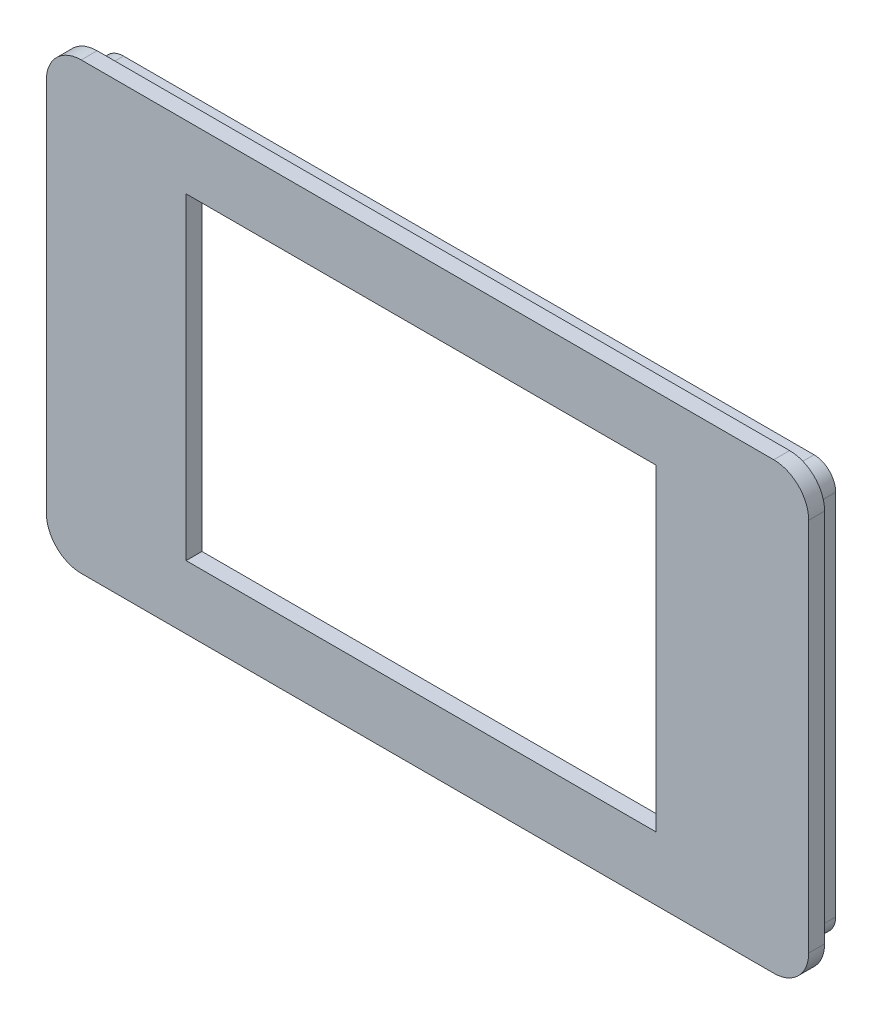
ISO-10303-21;
HEADER;
FILE_DESCRIPTION(('STEP AP214'),'2;1');
FILE_NAME('part.step','',(''),(''),'','','');
FILE_SCHEMA(('AUTOMOTIVE_DESIGN { 1 0 10303 214 1 1 1 1 }'));
ENDSEC;
DATA;
#1=APPLICATION_CONTEXT('core data for automotive mechanical design processes');
#2=APPLICATION_PROTOCOL_DEFINITION('international standard','automotive_design',2000,#1);
#3=PRODUCT_CONTEXT('',#1,'mechanical');
#4=PRODUCT('Part','Part','',(#3));
#5=PRODUCT_RELATED_PRODUCT_CATEGORY('part','',(#4));
#6=PRODUCT_DEFINITION_FORMATION('','',#4);
#7=PRODUCT_DEFINITION_CONTEXT('part definition',#1,'design');
#8=PRODUCT_DEFINITION('design','',#6,#7);
#9=PRODUCT_DEFINITION_SHAPE('','',#8);
#10=(LENGTH_UNIT() NAMED_UNIT(*) SI_UNIT(.MILLI.,.METRE.));
#11=(NAMED_UNIT(*) PLANE_ANGLE_UNIT() SI_UNIT($,.RADIAN.));
#12=(NAMED_UNIT(*) SI_UNIT($,.STERADIAN.) SOLID_ANGLE_UNIT());
#13=UNCERTAINTY_MEASURE_WITH_UNIT(LENGTH_MEASURE(1.E-05),#10,'distance_accuracy_value','');
#14=(GEOMETRIC_REPRESENTATION_CONTEXT(3) GLOBAL_UNCERTAINTY_ASSIGNED_CONTEXT((#13)) GLOBAL_UNIT_ASSIGNED_CONTEXT((#10,
#11,#12)) REPRESENTATION_CONTEXT('',''));
#15=CARTESIAN_POINT('',(0.,0.,0.));
#16=DIRECTION('',(0.,0.,1.));
#17=DIRECTION('',(1.,0.,0.));
#18=AXIS2_PLACEMENT_3D('',#15,#16,#17);
#19=CARTESIAN_POINT('',(0.,0.,0.));
#20=DIRECTION('',(0.,0.,1.));
#21=DIRECTION('',(1.,0.,0.));
#22=AXIS2_PLACEMENT_3D('',#19,#20,#21);
#23=PLANE('',#22);
#24=DIRECTION('',(0.,1.,0.));
#25=VECTOR('',#24,1.);
#26=CARTESIAN_POINT('',(44.6712724120404,25.0682598774568,0.));
#27=LINE('',#26,#25);
#28=CARTESIAN_POINT('',(44.6712724120404,-24.9317401225432,0.));
#29=VERTEX_POINT('',#28);
#30=CARTESIAN_POINT('',(44.6712724120404,25.0682598774568,0.));
#31=VERTEX_POINT('',#30);
#32=EDGE_CURVE('E401',#29,#31,#27,.T.);
#33=ORIENTED_EDGE('',*,*,#32,.T.);
#34=DIRECTION('',(-1.,0.,0.));
#35=VECTOR('',#34,1.);
#36=CARTESIAN_POINT('',(-29.3287275879596,25.0682598774568,0.));
#37=LINE('',#36,#35);
#38=CARTESIAN_POINT('',(-29.3287275879596,25.0682598774568,0.));
#39=VERTEX_POINT('',#38);
#40=EDGE_CURVE('E415',#31,#39,#37,.T.);
#41=ORIENTED_EDGE('',*,*,#40,.T.);
#42=DIRECTION('',(0.,-1.,0.));
#43=VECTOR('',#42,1.);
#44=CARTESIAN_POINT('',(-29.3287275879596,25.0682598774568,0.));
#45=LINE('',#44,#43);
#46=CARTESIAN_POINT('',(-29.3287275879596,-24.9317401225432,0.));
#47=VERTEX_POINT('',#46);
#48=EDGE_CURVE('E418',#39,#47,#45,.T.);
#49=ORIENTED_EDGE('',*,*,#48,.T.);
#50=DIRECTION('',(1.,0.,0.));
#51=VECTOR('',#50,1.);
#52=CARTESIAN_POINT('',(-29.3287275879596,-24.9317401225432,0.));
#53=LINE('',#52,#51);
#54=EDGE_CURVE('E405',#47,#29,#53,.T.);
#55=ORIENTED_EDGE('',*,*,#54,.T.);
#56=EDGE_LOOP('',(#33,#41,#49,#55));
#57=FACE_BOUND('',#56,.T.);
#58=CARTESIAN_POINT('',(63.0212724120405,29.0182598774568,0.));
#59=DIRECTION('',(0.,0.,-1.));
#60=DIRECTION('',(-1.,0.,0.));
#61=AXIS2_PLACEMENT_3D('',#58,#59,#60);
#62=CIRCLE('',#61,1.4);
#63=CARTESIAN_POINT('',(63.0212724120405,30.4182598774568,0.));
#64=VERTEX_POINT('',#63);
#65=CARTESIAN_POINT('',(64.4212724120405,29.0182598774568,0.));
#66=VERTEX_POINT('',#65);
#67=EDGE_CURVE('E280',#64,#66,#62,.T.);
#68=ORIENTED_EDGE('',*,*,#67,.T.);
#69=DIRECTION('',(0.,-1.,0.));
#70=VECTOR('',#69,1.);
#71=CARTESIAN_POINT('',(64.4212724120405,29.0182598774568,0.));
#72=LINE('',#71,#70);
#73=CARTESIAN_POINT('',(64.4212724120405,-28.8817401225433,0.));
#74=VERTEX_POINT('',#73);
#75=EDGE_CURVE('E310',#66,#74,#72,.T.);
#76=ORIENTED_EDGE('',*,*,#75,.T.);
#77=CARTESIAN_POINT('',(63.0212724120405,-28.8817401225433,0.));
#78=DIRECTION('',(0.,0.,-1.));
#79=DIRECTION('',(-1.,0.,0.));
#80=AXIS2_PLACEMENT_3D('',#77,#78,#79);
#81=CIRCLE('',#80,1.4);
#82=CARTESIAN_POINT('',(63.0212724120405,-30.2817401225433,0.));
#83=VERTEX_POINT('',#82);
#84=EDGE_CURVE('E286',#74,#83,#81,.T.);
#85=ORIENTED_EDGE('',*,*,#84,.T.);
#86=DIRECTION('',(-1.,0.,0.));
#87=VECTOR('',#86,1.);
#88=CARTESIAN_POINT('',(63.0212724120405,-30.2817401225433,0.));
#89=LINE('',#88,#87);
#90=CARTESIAN_POINT('',(-45.6787275879595,-30.2817401225433,0.));
#91=VERTEX_POINT('',#90);
#92=EDGE_CURVE('E313',#83,#91,#89,.T.);
#93=ORIENTED_EDGE('',*,*,#92,.T.);
#94=CARTESIAN_POINT('',(-45.6787275879595,-28.8817401225433,0.));
#95=DIRECTION('',(0.,0.,-1.));
#96=DIRECTION('',(-1.,0.,0.));
#97=AXIS2_PLACEMENT_3D('',#94,#95,#96);
#98=CIRCLE('',#97,1.4);
#99=CARTESIAN_POINT('',(-47.0787275879595,-28.8817401225433,0.));
#100=VERTEX_POINT('',#99);
#101=EDGE_CURVE('E316',#91,#100,#98,.T.);
#102=ORIENTED_EDGE('',*,*,#101,.T.);
#103=DIRECTION('',(0.,-1.,0.));
#104=VECTOR('',#103,1.);
#105=CARTESIAN_POINT('',(-47.0787275879595,29.0182598774568,0.));
#106=LINE('',#105,#104);
#107=CARTESIAN_POINT('',(-47.0787275879595,29.0182598774568,0.));
#108=VERTEX_POINT('',#107);
#109=EDGE_CURVE('E319',#108,#100,#106,.T.);
#110=ORIENTED_EDGE('',*,*,#109,.F.);
#111=CARTESIAN_POINT('',(-45.6787275879595,29.0182598774568,0.));
#112=DIRECTION('',(0.,0.,-1.));
#113=DIRECTION('',(-1.,0.,0.));
#114=AXIS2_PLACEMENT_3D('',#111,#112,#113);
#115=CIRCLE('',#114,1.4);
#116=CARTESIAN_POINT('',(-45.6787275879595,30.4182598774568,0.));
#117=VERTEX_POINT('',#116);
#118=EDGE_CURVE('E322',#117,#108,#115,.F.);
#119=ORIENTED_EDGE('',*,*,#118,.F.);
#120=DIRECTION('',(-1.,0.,0.));
#121=VECTOR('',#120,1.);
#122=CARTESIAN_POINT('',(63.0212724120405,30.4182598774568,0.));
#123=LINE('',#122,#121);
#124=EDGE_CURVE('E325',#64,#117,#123,.T.);
#125=ORIENTED_EDGE('',*,*,#124,.F.);
#126=EDGE_LOOP('',(#68,#76,#85,#93,#102,#110,#119,#125));
#127=FACE_BOUND('',#126,.T.);
#128=ADVANCED_FACE('F85',(#57,#127),#23,.F.);
#129=CARTESIAN_POINT('',(0.,0.,2.5));
#130=DIRECTION('',(0.,0.,1.));
#131=DIRECTION('',(1.,0.,0.));
#132=AXIS2_PLACEMENT_3D('',#129,#130,#131);
#133=PLANE('',#132);
#134=DIRECTION('',(-1.,0.,0.));
#135=VECTOR('',#134,1.);
#136=CARTESIAN_POINT('',(-51.3287275879596,35.0682598774568,2.5));
#137=LINE('',#136,#135);
#138=CARTESIAN_POINT('',(63.1712724120404,35.0682598774568,2.5));
#139=VERTEX_POINT('',#138);
#140=CARTESIAN_POINT('',(-45.8287275879596,35.0682598774568,2.5));
#141=VERTEX_POINT('',#140);
#142=EDGE_CURVE('E443',#139,#141,#137,.T.);
#143=ORIENTED_EDGE('',*,*,#142,.T.);
#144=CARTESIAN_POINT('',(-45.8287275879596,29.5682598774568,2.5));
#145=DIRECTION('',(0.,0.,1.));
#146=DIRECTION('',(1.,0.,0.));
#147=AXIS2_PLACEMENT_3D('',#144,#145,#146);
#148=CIRCLE('',#147,5.5);
#149=CARTESIAN_POINT('',(-51.3287275879596,29.5682598774568,2.5));
#150=VERTEX_POINT('',#149);
#151=EDGE_CURVE('E480',#141,#150,#148,.T.);
#152=ORIENTED_EDGE('',*,*,#151,.T.);
#153=DIRECTION('',(0.,-1.,0.));
#154=VECTOR('',#153,1.);
#155=CARTESIAN_POINT('',(-51.3287275879596,35.0682598774568,2.5));
#156=LINE('',#155,#154);
#157=CARTESIAN_POINT('',(-51.3287275879596,-29.4317401225432,2.5));
#158=VERTEX_POINT('',#157);
#159=EDGE_CURVE('E433',#150,#158,#156,.T.);
#160=ORIENTED_EDGE('',*,*,#159,.T.);
#161=CARTESIAN_POINT('',(-45.8287275879596,-29.4317401225432,2.5));
#162=DIRECTION('',(0.,0.,1.));
#163=DIRECTION('',(1.,0.,0.));
#164=AXIS2_PLACEMENT_3D('',#161,#162,#163);
#165=CIRCLE('',#164,5.5);
#166=CARTESIAN_POINT('',(-45.8287275879596,-34.9317401225432,2.5));
#167=VERTEX_POINT('',#166);
#168=EDGE_CURVE('E478',#158,#167,#165,.T.);
#169=ORIENTED_EDGE('',*,*,#168,.T.);
#170=DIRECTION('',(1.,0.,0.));
#171=VECTOR('',#170,1.);
#172=CARTESIAN_POINT('',(-51.3287275879596,-34.9317401225432,2.5));
#173=LINE('',#172,#171);
#174=CARTESIAN_POINT('',(63.1712724120404,-34.9317401225432,2.5));
#175=VERTEX_POINT('',#174);
#176=EDGE_CURVE('E436',#167,#175,#173,.T.);
#177=ORIENTED_EDGE('',*,*,#176,.T.);
#178=CARTESIAN_POINT('',(63.1712724120404,-29.4317401225432,2.5));
#179=DIRECTION('',(0.,0.,1.));
#180=DIRECTION('',(1.,0.,0.));
#181=AXIS2_PLACEMENT_3D('',#178,#179,#180);
#182=CIRCLE('',#181,5.5);
#183=CARTESIAN_POINT('',(68.6712724120404,-29.4317401225432,2.5));
#184=VERTEX_POINT('',#183);
#185=EDGE_CURVE('E476',#175,#184,#182,.T.);
#186=ORIENTED_EDGE('',*,*,#185,.T.);
#187=DIRECTION('',(0.,1.,0.));
#188=VECTOR('',#187,1.);
#189=CARTESIAN_POINT('',(68.6712724120404,35.0682598774568,2.5));
#190=LINE('',#189,#188);
#191=CARTESIAN_POINT('',(68.6712724120404,29.5682598774568,2.5));
#192=VERTEX_POINT('',#191);
#193=EDGE_CURVE('E440',#184,#192,#190,.T.);
#194=ORIENTED_EDGE('',*,*,#193,.T.);
#195=CARTESIAN_POINT('',(63.1712724120404,29.5682598774568,2.5));
#196=DIRECTION('',(0.,0.,1.));
#197=DIRECTION('',(1.,0.,0.));
#198=AXIS2_PLACEMENT_3D('',#195,#196,#197);
#199=CIRCLE('',#198,5.5);
#200=EDGE_CURVE('E474',#192,#139,#199,.T.);
#201=ORIENTED_EDGE('',*,*,#200,.T.);
#202=EDGE_LOOP('',(#143,#152,#160,#169,#177,#186,#194,#201));
#203=FACE_BOUND('',#202,.T.);
#204=DIRECTION('',(-1.,0.,0.));
#205=VECTOR('',#204,1.);
#206=CARTESIAN_POINT('',(-29.3287275879596,25.0682598774568,2.5));
#207=LINE('',#206,#205);
#208=CARTESIAN_POINT('',(44.6712724120404,25.0682598774568,2.5));
#209=VERTEX_POINT('',#208);
#210=CARTESIAN_POINT('',(-29.3287275879596,25.0682598774568,2.5));
#211=VERTEX_POINT('',#210);
#212=EDGE_CURVE('E404',#209,#211,#207,.T.);
#213=ORIENTED_EDGE('',*,*,#212,.F.);
#214=DIRECTION('',(0.,1.,0.));
#215=VECTOR('',#214,1.);
#216=CARTESIAN_POINT('',(44.6712724120404,25.0682598774568,2.5));
#217=LINE('',#216,#215);
#218=CARTESIAN_POINT('',(44.6712724120404,-24.9317401225432,2.5));
#219=VERTEX_POINT('',#218);
#220=EDGE_CURVE('E402',#219,#209,#217,.T.);
#221=ORIENTED_EDGE('',*,*,#220,.F.);
#222=DIRECTION('',(1.,0.,0.));
#223=VECTOR('',#222,1.);
#224=CARTESIAN_POINT('',(-29.3287275879596,-24.9317401225432,2.5));
#225=LINE('',#224,#223);
#226=CARTESIAN_POINT('',(-29.3287275879596,-24.9317401225432,2.5));
#227=VERTEX_POINT('',#226);
#228=EDGE_CURVE('E410',#227,#219,#225,.T.);
#229=ORIENTED_EDGE('',*,*,#228,.F.);
#230=DIRECTION('',(0.,-1.,0.));
#231=VECTOR('',#230,1.);
#232=CARTESIAN_POINT('',(-29.3287275879596,25.0682598774568,2.5));
#233=LINE('',#232,#231);
#234=EDGE_CURVE('E407',#211,#227,#233,.T.);
#235=ORIENTED_EDGE('',*,*,#234,.F.);
#236=EDGE_LOOP('',(#213,#221,#229,#235));
#237=FACE_BOUND('',#236,.T.);
#238=ADVANCED_FACE('F495',(#203,#237),#133,.T.);
#239=DIRECTION('',(0.,-1.,0.));
#240=VECTOR('',#239,1.);
#241=CARTESIAN_POINT('',(66.4212724120405,29.0182598774568,0.));
#242=LINE('',#241,#240);
#243=CARTESIAN_POINT('',(66.4212724120405,29.0182598774568,0.));
#244=VERTEX_POINT('',#243);
#245=CARTESIAN_POINT('',(66.4212724120405,-28.8817401225433,0.));
#246=VERTEX_POINT('',#245);
#247=EDGE_CURVE('E287',#244,#246,#242,.T.);
#248=ORIENTED_EDGE('',*,*,#247,.F.);
#249=CARTESIAN_POINT('',(63.0212724120405,29.0182598774568,0.));
#250=DIRECTION('',(0.,0.,-1.));
#251=DIRECTION('',(-1.,0.,0.));
#252=AXIS2_PLACEMENT_3D('',#249,#250,#251);
#253=CIRCLE('',#252,3.4);
#254=CARTESIAN_POINT('',(63.0212724120405,32.4182598774568,0.));
#255=VERTEX_POINT('',#254);
#256=EDGE_CURVE('E346',#255,#244,#253,.T.);
#257=ORIENTED_EDGE('',*,*,#256,.F.);
#258=DIRECTION('',(-1.,0.,0.));
#259=VECTOR('',#258,1.);
#260=CARTESIAN_POINT('',(63.0212724120405,32.4182598774568,0.));
#261=LINE('',#260,#259);
#262=CARTESIAN_POINT('',(-45.6787275879595,32.4182598774568,0.));
#263=VERTEX_POINT('',#262);
#264=EDGE_CURVE('E375',#255,#263,#261,.T.);
#265=ORIENTED_EDGE('',*,*,#264,.T.);
#266=CARTESIAN_POINT('',(-45.6787275879595,29.0182598774568,0.));
#267=DIRECTION('',(0.,0.,1.));
#268=DIRECTION('',(1.,0.,0.));
#269=AXIS2_PLACEMENT_3D('',#266,#267,#268);
#270=CIRCLE('',#269,3.4);
#271=CARTESIAN_POINT('',(-49.0787275879595,29.0182598774568,0.));
#272=VERTEX_POINT('',#271);
#273=EDGE_CURVE('E373',#263,#272,#270,.T.);
#274=ORIENTED_EDGE('',*,*,#273,.T.);
#275=DIRECTION('',(0.,-1.,0.));
#276=VECTOR('',#275,1.);
#277=CARTESIAN_POINT('',(-49.0787275879595,29.0182598774568,0.));
#278=LINE('',#277,#276);
#279=CARTESIAN_POINT('',(-49.0787275879595,-28.8817401225433,0.));
#280=VERTEX_POINT('',#279);
#281=EDGE_CURVE('E371',#272,#280,#278,.T.);
#282=ORIENTED_EDGE('',*,*,#281,.T.);
#283=CARTESIAN_POINT('',(-45.6787275879595,-28.8817401225433,0.));
#284=DIRECTION('',(0.,0.,-1.));
#285=DIRECTION('',(-1.,0.,0.));
#286=AXIS2_PLACEMENT_3D('',#283,#284,#285);
#287=CIRCLE('',#286,3.4);
#288=CARTESIAN_POINT('',(-45.6787275879595,-32.2817401225433,0.));
#289=VERTEX_POINT('',#288);
#290=EDGE_CURVE('E368',#289,#280,#287,.T.);
#291=ORIENTED_EDGE('',*,*,#290,.F.);
#292=DIRECTION('',(-1.,0.,0.));
#293=VECTOR('',#292,1.);
#294=CARTESIAN_POINT('',(63.0212724120405,-32.2817401225433,0.));
#295=LINE('',#294,#293);
#296=CARTESIAN_POINT('',(63.0212724120405,-32.2817401225433,0.));
#297=VERTEX_POINT('',#296);
#298=EDGE_CURVE('E105',#297,#289,#295,.T.);
#299=ORIENTED_EDGE('',*,*,#298,.F.);
#300=CARTESIAN_POINT('',(63.0212724120405,-28.8817401225433,0.));
#301=DIRECTION('',(0.,0.,-1.));
#302=DIRECTION('',(-1.,0.,0.));
#303=AXIS2_PLACEMENT_3D('',#300,#301,#302);
#304=CIRCLE('',#303,3.4);
#305=EDGE_CURVE('E100',#246,#297,#304,.T.);
#306=ORIENTED_EDGE('',*,*,#305,.F.);
#307=EDGE_LOOP('',(#248,#257,#265,#274,#282,#291,#299,#306));
#308=FACE_BOUND('',#307,.T.);
#309=DIRECTION('',(0.,-1.,0.));
#310=VECTOR('',#309,1.);
#311=CARTESIAN_POINT('',(-51.3287275879596,35.0682598774568,0.));
#312=LINE('',#311,#310);
#313=CARTESIAN_POINT('',(-51.3287275879596,29.5682598774568,0.));
#314=VERTEX_POINT('',#313);
#315=CARTESIAN_POINT('',(-51.3287275879596,-29.4317401225432,0.));
#316=VERTEX_POINT('',#315);
#317=EDGE_CURVE('E432',#314,#316,#312,.T.);
#318=ORIENTED_EDGE('',*,*,#317,.F.);
#319=CARTESIAN_POINT('',(-45.8287275879596,29.5682598774568,0.));
#320=DIRECTION('',(0.,0.,1.));
#321=DIRECTION('',(1.,0.,0.));
#322=AXIS2_PLACEMENT_3D('',#319,#320,#321);
#323=CIRCLE('',#322,5.5);
#324=CARTESIAN_POINT('',(-45.8287275879596,35.0682598774568,0.));
#325=VERTEX_POINT('',#324);
#326=EDGE_CURVE('E467',#314,#325,#323,.F.);
#327=ORIENTED_EDGE('',*,*,#326,.T.);
#328=DIRECTION('',(-1.,0.,0.));
#329=VECTOR('',#328,1.);
#330=CARTESIAN_POINT('',(-51.3287275879596,35.0682598774568,0.));
#331=LINE('',#330,#329);
#332=CARTESIAN_POINT('',(63.1712724120404,35.0682598774568,0.));
#333=VERTEX_POINT('',#332);
#334=EDGE_CURVE('E437',#333,#325,#331,.T.);
#335=ORIENTED_EDGE('',*,*,#334,.F.);
#336=CARTESIAN_POINT('',(63.1712724120404,29.5682598774568,0.));
#337=DIRECTION('',(0.,0.,1.));
#338=DIRECTION('',(1.,0.,0.));
#339=AXIS2_PLACEMENT_3D('',#336,#337,#338);
#340=CIRCLE('',#339,5.5);
#341=CARTESIAN_POINT('',(68.6712724120404,29.5682598774568,0.));
#342=VERTEX_POINT('',#341);
#343=EDGE_CURVE('E461',#333,#342,#340,.F.);
#344=ORIENTED_EDGE('',*,*,#343,.T.);
#345=DIRECTION('',(0.,1.,0.));
#346=VECTOR('',#345,1.);
#347=CARTESIAN_POINT('',(68.6712724120404,35.0682598774568,0.));
#348=LINE('',#347,#346);
#349=CARTESIAN_POINT('',(68.6712724120404,-29.4317401225432,0.));
#350=VERTEX_POINT('',#349);
#351=EDGE_CURVE('E452',#350,#342,#348,.T.);
#352=ORIENTED_EDGE('',*,*,#351,.F.);
#353=CARTESIAN_POINT('',(63.1712724120404,-29.4317401225432,0.));
#354=DIRECTION('',(0.,0.,1.));
#355=DIRECTION('',(1.,0.,0.));
#356=AXIS2_PLACEMENT_3D('',#353,#354,#355);
#357=CIRCLE('',#356,5.5);
#358=CARTESIAN_POINT('',(63.1712724120404,-34.9317401225432,0.));
#359=VERTEX_POINT('',#358);
#360=EDGE_CURVE('E463',#350,#359,#357,.F.);
#361=ORIENTED_EDGE('',*,*,#360,.T.);
#362=DIRECTION('',(1.,0.,0.));
#363=VECTOR('',#362,1.);
#364=CARTESIAN_POINT('',(-51.3287275879596,-34.9317401225432,0.));
#365=LINE('',#364,#363);
#366=CARTESIAN_POINT('',(-45.8287275879596,-34.9317401225432,0.));
#367=VERTEX_POINT('',#366);
#368=EDGE_CURVE('E449',#367,#359,#365,.T.);
#369=ORIENTED_EDGE('',*,*,#368,.F.);
#370=CARTESIAN_POINT('',(-45.8287275879596,-29.4317401225432,0.));
#371=DIRECTION('',(0.,0.,1.));
#372=DIRECTION('',(1.,0.,0.));
#373=AXIS2_PLACEMENT_3D('',#370,#371,#372);
#374=CIRCLE('',#373,5.5);
#375=EDGE_CURVE('E465',#367,#316,#374,.F.);
#376=ORIENTED_EDGE('',*,*,#375,.T.);
#377=EDGE_LOOP('',(#318,#327,#335,#344,#352,#361,#369,#376));
#378=FACE_BOUND('',#377,.T.);
#379=ADVANCED_FACE('F506',(#308,#378),#23,.F.);
#380=CARTESIAN_POINT('',(-51.3287275879596,35.0682598774568,2.5));
#381=DIRECTION('',(1.,0.,0.));
#382=DIRECTION('',(0.,1.,0.));
#383=AXIS2_PLACEMENT_3D('',#380,#381,#382);
#384=PLANE('',#383);
#385=ORIENTED_EDGE('',*,*,#159,.F.);
#386=DIRECTION('',(0.,0.,-1.));
#387=VECTOR('',#386,1.);
#388=CARTESIAN_POINT('',(-51.3287275879596,29.5682598774568,2.5));
#389=LINE('',#388,#387);
#390=EDGE_CURVE('E458',#150,#314,#389,.T.);
#391=ORIENTED_EDGE('',*,*,#390,.T.);
#392=ORIENTED_EDGE('',*,*,#317,.T.);
#393=DIRECTION('',(0.,0.,-1.));
#394=VECTOR('',#393,1.);
#395=CARTESIAN_POINT('',(-51.3287275879596,-29.4317401225432,2.5));
#396=LINE('',#395,#394);
#397=EDGE_CURVE('E446',#316,#158,#396,.F.);
#398=ORIENTED_EDGE('',*,*,#397,.T.);
#399=EDGE_LOOP('',(#385,#391,#392,#398));
#400=FACE_BOUND('',#399,.T.);
#401=ADVANCED_FACE('F513',(#400),#384,.F.);
#402=CARTESIAN_POINT('',(-51.3287275879596,-34.9317401225432,2.5));
#403=DIRECTION('',(0.,1.,0.));
#404=DIRECTION('',(0.,0.,1.));
#405=AXIS2_PLACEMENT_3D('',#402,#403,#404);
#406=PLANE('',#405);
#407=ORIENTED_EDGE('',*,*,#176,.F.);
#408=DIRECTION('',(0.,0.,-1.));
#409=VECTOR('',#408,1.);
#410=CARTESIAN_POINT('',(-45.8287275879596,-34.9317401225432,2.5));
#411=LINE('',#410,#409);
#412=EDGE_CURVE('E484',#167,#367,#411,.T.);
#413=ORIENTED_EDGE('',*,*,#412,.T.);
#414=ORIENTED_EDGE('',*,*,#368,.T.);
#415=DIRECTION('',(0.,0.,-1.));
#416=VECTOR('',#415,1.);
#417=CARTESIAN_POINT('',(63.1712724120404,-34.9317401225432,2.5));
#418=LINE('',#417,#416);
#419=EDGE_CURVE('E482',#359,#175,#418,.F.);
#420=ORIENTED_EDGE('',*,*,#419,.T.);
#421=EDGE_LOOP('',(#407,#413,#414,#420));
#422=FACE_BOUND('',#421,.T.);
#423=ADVANCED_FACE('F522',(#422),#406,.F.);
#424=CARTESIAN_POINT('',(68.6712724120404,35.0682598774568,2.5));
#425=DIRECTION('',(-1.,0.,0.));
#426=DIRECTION('',(0.,0.,1.));
#427=AXIS2_PLACEMENT_3D('',#424,#425,#426);
#428=PLANE('',#427);
#429=ORIENTED_EDGE('',*,*,#193,.F.);
#430=DIRECTION('',(0.,0.,-1.));
#431=VECTOR('',#430,1.);
#432=CARTESIAN_POINT('',(68.6712724120404,-29.4317401225432,2.5));
#433=LINE('',#432,#431);
#434=EDGE_CURVE('E12',#184,#350,#433,.T.);
#435=ORIENTED_EDGE('',*,*,#434,.T.);
#436=ORIENTED_EDGE('',*,*,#351,.T.);
#437=DIRECTION('',(0.,0.,-1.));
#438=VECTOR('',#437,1.);
#439=CARTESIAN_POINT('',(68.6712724120404,29.5682598774568,2.5));
#440=LINE('',#439,#438);
#441=EDGE_CURVE('E93',#342,#192,#440,.F.);
#442=ORIENTED_EDGE('',*,*,#441,.T.);
#443=EDGE_LOOP('',(#429,#435,#436,#442));
#444=FACE_BOUND('',#443,.T.);
#445=ADVANCED_FACE('F489',(#444),#428,.F.);
#446=CARTESIAN_POINT('',(-51.3287275879596,35.0682598774568,2.5));
#447=DIRECTION('',(0.,-1.,0.));
#448=DIRECTION('',(0.,0.,-1.));
#449=AXIS2_PLACEMENT_3D('',#446,#447,#448);
#450=PLANE('',#449);
#451=ORIENTED_EDGE('',*,*,#334,.T.);
#452=DIRECTION('',(0.,0.,-1.));
#453=VECTOR('',#452,1.);
#454=CARTESIAN_POINT('',(-45.8287275879596,35.0682598774568,2.5));
#455=LINE('',#454,#453);
#456=EDGE_CURVE('E472',#325,#141,#455,.F.);
#457=ORIENTED_EDGE('',*,*,#456,.T.);
#458=ORIENTED_EDGE('',*,*,#142,.F.);
#459=DIRECTION('',(0.,0.,-1.));
#460=VECTOR('',#459,1.);
#461=CARTESIAN_POINT('',(63.1712724120404,35.0682598774568,2.5));
#462=LINE('',#461,#460);
#463=EDGE_CURVE('E469',#139,#333,#462,.T.);
#464=ORIENTED_EDGE('',*,*,#463,.T.);
#465=EDGE_LOOP('',(#451,#457,#458,#464));
#466=FACE_BOUND('',#465,.T.);
#467=ADVANCED_FACE('F502',(#466),#450,.F.);
#468=CARTESIAN_POINT('',(44.6712724120404,25.0682598774568,2.5));
#469=DIRECTION('',(-1.,0.,0.));
#470=DIRECTION('',(0.,0.,1.));
#471=AXIS2_PLACEMENT_3D('',#468,#469,#470);
#472=PLANE('',#471);
#473=ORIENTED_EDGE('',*,*,#32,.F.);
#474=DIRECTION('',(0.,0.,-1.));
#475=VECTOR('',#474,1.);
#476=CARTESIAN_POINT('',(44.6712724120404,-24.9317401225432,2.5));
#477=LINE('',#476,#475);
#478=EDGE_CURVE('E412',#219,#29,#477,.T.);
#479=ORIENTED_EDGE('',*,*,#478,.F.);
#480=ORIENTED_EDGE('',*,*,#220,.T.);
#481=DIRECTION('',(0.,0.,-1.));
#482=VECTOR('',#481,1.);
#483=CARTESIAN_POINT('',(44.6712724120404,25.0682598774568,2.5));
#484=LINE('',#483,#482);
#485=EDGE_CURVE('E429',#209,#31,#484,.T.);
#486=ORIENTED_EDGE('',*,*,#485,.T.);
#487=EDGE_LOOP('',(#473,#479,#480,#486));
#488=FACE_BOUND('',#487,.T.);
#489=ADVANCED_FACE('F599',(#488),#472,.T.);
#490=CARTESIAN_POINT('',(-29.3287275879596,25.0682598774568,2.5));
#491=DIRECTION('',(0.,-1.,0.));
#492=DIRECTION('',(0.,0.,-1.));
#493=AXIS2_PLACEMENT_3D('',#490,#491,#492);
#494=PLANE('',#493);
#495=ORIENTED_EDGE('',*,*,#40,.F.);
#496=ORIENTED_EDGE('',*,*,#485,.F.);
#497=ORIENTED_EDGE('',*,*,#212,.T.);
#498=DIRECTION('',(0.,0.,-1.));
#499=VECTOR('',#498,1.);
#500=CARTESIAN_POINT('',(-29.3287275879596,25.0682598774568,2.5));
#501=LINE('',#500,#499);
#502=EDGE_CURVE('E427',#211,#39,#501,.T.);
#503=ORIENTED_EDGE('',*,*,#502,.T.);
#504=EDGE_LOOP('',(#495,#496,#497,#503));
#505=FACE_BOUND('',#504,.T.);
#506=ADVANCED_FACE('F595',(#505),#494,.T.);
#507=CARTESIAN_POINT('',(-29.3287275879596,25.0682598774568,2.5));
#508=DIRECTION('',(1.,0.,0.));
#509=DIRECTION('',(0.,0.,-1.));
#510=AXIS2_PLACEMENT_3D('',#507,#508,#509);
#511=PLANE('',#510);
#512=ORIENTED_EDGE('',*,*,#48,.F.);
#513=ORIENTED_EDGE('',*,*,#502,.F.);
#514=ORIENTED_EDGE('',*,*,#234,.T.);
#515=DIRECTION('',(0.,0.,-1.));
#516=VECTOR('',#515,1.);
#517=CARTESIAN_POINT('',(-29.3287275879596,-24.9317401225432,2.5));
#518=LINE('',#517,#516);
#519=EDGE_CURVE('E425',#227,#47,#518,.T.);
#520=ORIENTED_EDGE('',*,*,#519,.T.);
#521=EDGE_LOOP('',(#512,#513,#514,#520));
#522=FACE_BOUND('',#521,.T.);
#523=ADVANCED_FACE('F591',(#522),#511,.T.);
#524=CARTESIAN_POINT('',(-29.3287275879596,-24.9317401225432,2.5));
#525=DIRECTION('',(0.,1.,0.));
#526=DIRECTION('',(0.,0.,1.));
#527=AXIS2_PLACEMENT_3D('',#524,#525,#526);
#528=PLANE('',#527);
#529=ORIENTED_EDGE('',*,*,#54,.F.);
#530=ORIENTED_EDGE('',*,*,#519,.F.);
#531=ORIENTED_EDGE('',*,*,#228,.T.);
#532=ORIENTED_EDGE('',*,*,#478,.T.);
#533=EDGE_LOOP('',(#529,#530,#531,#532));
#534=FACE_BOUND('',#533,.T.);
#535=ADVANCED_FACE('F588',(#534),#528,.T.);
#536=CARTESIAN_POINT('',(-45.8287275879596,29.5682598774568,2.5));
#537=DIRECTION('',(0.,0.,-1.));
#538=DIRECTION('',(-1.,0.,0.));
#539=AXIS2_PLACEMENT_3D('',#536,#537,#538);
#540=CYLINDRICAL_SURFACE('',#539,5.5);
#541=ORIENTED_EDGE('',*,*,#151,.F.);
#542=ORIENTED_EDGE('',*,*,#456,.F.);
#543=ORIENTED_EDGE('',*,*,#326,.F.);
#544=ORIENTED_EDGE('',*,*,#390,.F.);
#545=EDGE_LOOP('',(#541,#542,#543,#544));
#546=FACE_BOUND('',#545,.T.);
#547=ADVANCED_FACE('F510',(#546),#540,.T.);
#548=CARTESIAN_POINT('',(-45.8287275879596,-29.4317401225432,2.5));
#549=DIRECTION('',(0.,0.,-1.));
#550=DIRECTION('',(-1.,0.,0.));
#551=AXIS2_PLACEMENT_3D('',#548,#549,#550);
#552=CYLINDRICAL_SURFACE('',#551,5.5);
#553=ORIENTED_EDGE('',*,*,#168,.F.);
#554=ORIENTED_EDGE('',*,*,#397,.F.);
#555=ORIENTED_EDGE('',*,*,#375,.F.);
#556=ORIENTED_EDGE('',*,*,#412,.F.);
#557=EDGE_LOOP('',(#553,#554,#555,#556));
#558=FACE_BOUND('',#557,.T.);
#559=ADVANCED_FACE('F519',(#558),#552,.T.);
#560=CARTESIAN_POINT('',(63.1712724120404,-29.4317401225432,2.5));
#561=DIRECTION('',(0.,0.,-1.));
#562=DIRECTION('',(-1.,0.,0.));
#563=AXIS2_PLACEMENT_3D('',#560,#561,#562);
#564=CYLINDRICAL_SURFACE('',#563,5.5);
#565=ORIENTED_EDGE('',*,*,#185,.F.);
#566=ORIENTED_EDGE('',*,*,#419,.F.);
#567=ORIENTED_EDGE('',*,*,#360,.F.);
#568=ORIENTED_EDGE('',*,*,#434,.F.);
#569=EDGE_LOOP('',(#565,#566,#567,#568));
#570=FACE_BOUND('',#569,.T.);
#571=ADVANCED_FACE('F525',(#570),#564,.T.);
#572=CARTESIAN_POINT('',(63.1712724120404,29.5682598774568,2.5));
#573=DIRECTION('',(0.,0.,-1.));
#574=DIRECTION('',(-1.,0.,0.));
#575=AXIS2_PLACEMENT_3D('',#572,#573,#574);
#576=CYLINDRICAL_SURFACE('',#575,5.5);
#577=ORIENTED_EDGE('',*,*,#200,.F.);
#578=ORIENTED_EDGE('',*,*,#441,.F.);
#579=ORIENTED_EDGE('',*,*,#343,.F.);
#580=ORIENTED_EDGE('',*,*,#463,.F.);
#581=EDGE_LOOP('',(#577,#578,#579,#580));
#582=FACE_BOUND('',#581,.T.);
#583=ADVANCED_FACE('F87',(#582),#576,.T.);
#584=CARTESIAN_POINT('',(63.0212724120405,-28.8817401225433,-4.));
#585=DIRECTION('',(0.,0.,-1.));
#586=DIRECTION('',(-1.,0.,0.));
#587=AXIS2_PLACEMENT_3D('',#584,#585,#586);
#588=PLANE('',#587);
#589=DIRECTION('',(0.,-1.,0.));
#590=VECTOR('',#589,1.);
#591=CARTESIAN_POINT('',(66.4212724120405,29.0182598774568,-4.));
#592=LINE('',#591,#590);
#593=CARTESIAN_POINT('',(66.4212724120405,29.0182598774568,-4.));
#594=VERTEX_POINT('',#593);
#595=CARTESIAN_POINT('',(66.4212724120405,-28.8817401225433,-4.));
#596=VERTEX_POINT('',#595);
#597=EDGE_CURVE('E342',#594,#596,#592,.T.);
#598=ORIENTED_EDGE('',*,*,#597,.T.);
#599=CARTESIAN_POINT('',(63.0212724120405,-28.8817401225433,-4.));
#600=DIRECTION('',(0.,0.,-1.));
#601=DIRECTION('',(-1.,0.,0.));
#602=AXIS2_PLACEMENT_3D('',#599,#600,#601);
#603=CIRCLE('',#602,3.4);
#604=CARTESIAN_POINT('',(63.0212724120405,-32.2817401225433,-4.));
#605=VERTEX_POINT('',#604);
#606=EDGE_CURVE('E345',#596,#605,#603,.T.);
#607=ORIENTED_EDGE('',*,*,#606,.T.);
#608=DIRECTION('',(-1.,0.,0.));
#609=VECTOR('',#608,1.);
#610=CARTESIAN_POINT('',(63.0212724120405,-32.2817401225433,-4.));
#611=LINE('',#610,#609);
#612=CARTESIAN_POINT('',(-45.6787275879595,-32.2817401225433,-4.));
#613=VERTEX_POINT('',#612);
#614=EDGE_CURVE('E348',#605,#613,#611,.T.);
#615=ORIENTED_EDGE('',*,*,#614,.T.);
#616=CARTESIAN_POINT('',(-45.6787275879595,-28.8817401225433,-4.));
#617=DIRECTION('',(0.,0.,-1.));
#618=DIRECTION('',(-1.,0.,0.));
#619=AXIS2_PLACEMENT_3D('',#616,#617,#618);
#620=CIRCLE('',#619,3.4);
#621=CARTESIAN_POINT('',(-49.0787275879595,-28.8817401225433,-4.));
#622=VERTEX_POINT('',#621);
#623=EDGE_CURVE('E350',#613,#622,#620,.T.);
#624=ORIENTED_EDGE('',*,*,#623,.T.);
#625=DIRECTION('',(0.,-1.,0.));
#626=VECTOR('',#625,1.);
#627=CARTESIAN_POINT('',(-49.0787275879595,29.0182598774568,-4.));
#628=LINE('',#627,#626);
#629=CARTESIAN_POINT('',(-49.0787275879595,29.0182598774568,-4.));
#630=VERTEX_POINT('',#629);
#631=EDGE_CURVE('E352',#630,#622,#628,.T.);
#632=ORIENTED_EDGE('',*,*,#631,.F.);
#633=CARTESIAN_POINT('',(-45.6787275879595,29.0182598774568,-4.));
#634=DIRECTION('',(0.,0.,1.));
#635=DIRECTION('',(1.,0.,0.));
#636=AXIS2_PLACEMENT_3D('',#633,#634,#635);
#637=CIRCLE('',#636,3.4);
#638=CARTESIAN_POINT('',(-45.6787275879595,32.4182598774568,-4.));
#639=VERTEX_POINT('',#638);
#640=EDGE_CURVE('E355',#639,#630,#637,.T.);
#641=ORIENTED_EDGE('',*,*,#640,.F.);
#642=DIRECTION('',(-1.,0.,0.));
#643=VECTOR('',#642,1.);
#644=CARTESIAN_POINT('',(63.0212724120405,32.4182598774568,-4.));
#645=LINE('',#644,#643);
#646=CARTESIAN_POINT('',(63.0212724120405,32.4182598774568,-4.));
#647=VERTEX_POINT('',#646);
#648=EDGE_CURVE('E358',#647,#639,#645,.T.);
#649=ORIENTED_EDGE('',*,*,#648,.F.);
#650=CARTESIAN_POINT('',(63.0212724120405,29.0182598774568,-4.));
#651=DIRECTION('',(0.,0.,-1.));
#652=DIRECTION('',(-1.,0.,0.));
#653=AXIS2_PLACEMENT_3D('',#650,#651,#652);
#654=CIRCLE('',#653,3.4);
#655=EDGE_CURVE('E361',#647,#594,#654,.T.);
#656=ORIENTED_EDGE('',*,*,#655,.T.);
#657=EDGE_LOOP('',(#598,#607,#615,#624,#632,#641,#649,#656));
#658=FACE_BOUND('',#657,.T.);
#659=CARTESIAN_POINT('',(63.0212724120405,-28.8817401225433,-4.));
#660=DIRECTION('',(0.,0.,-1.));
#661=DIRECTION('',(-1.,0.,0.));
#662=AXIS2_PLACEMENT_3D('',#659,#660,#661);
#663=CIRCLE('',#662,1.4);
#664=CARTESIAN_POINT('',(64.4212724120405,-28.8817401225433,-4.));
#665=VERTEX_POINT('',#664);
#666=CARTESIAN_POINT('',(63.0212724120405,-30.2817401225433,-4.));
#667=VERTEX_POINT('',#666);
#668=EDGE_CURVE('E279',#665,#667,#663,.T.);
#669=ORIENTED_EDGE('',*,*,#668,.F.);
#670=DIRECTION('',(0.,-1.,0.));
#671=VECTOR('',#670,1.);
#672=CARTESIAN_POINT('',(64.4212724120405,29.0182598774568,-4.));
#673=LINE('',#672,#671);
#674=CARTESIAN_POINT('',(64.4212724120405,29.0182598774568,-4.));
#675=VERTEX_POINT('',#674);
#676=EDGE_CURVE('E269',#675,#665,#673,.T.);
#677=ORIENTED_EDGE('',*,*,#676,.F.);
#678=CARTESIAN_POINT('',(63.0212724120405,29.0182598774568,-4.));
#679=DIRECTION('',(0.,0.,-1.));
#680=DIRECTION('',(-1.,0.,0.));
#681=AXIS2_PLACEMENT_3D('',#678,#679,#680);
#682=CIRCLE('',#681,1.4);
#683=CARTESIAN_POINT('',(63.0212724120405,30.4182598774568,-4.));
#684=VERTEX_POINT('',#683);
#685=EDGE_CURVE('E308',#684,#675,#682,.T.);
#686=ORIENTED_EDGE('',*,*,#685,.F.);
#687=DIRECTION('',(-1.,0.,0.));
#688=VECTOR('',#687,1.);
#689=CARTESIAN_POINT('',(63.0212724120405,30.4182598774568,-4.));
#690=LINE('',#689,#688);
#691=CARTESIAN_POINT('',(-45.6787275879595,30.4182598774568,-4.));
#692=VERTEX_POINT('',#691);
#693=EDGE_CURVE('E305',#684,#692,#690,.T.);
#694=ORIENTED_EDGE('',*,*,#693,.T.);
#695=CARTESIAN_POINT('',(-45.6787275879595,29.0182598774568,-4.));
#696=DIRECTION('',(0.,0.,-1.));
#697=DIRECTION('',(-1.,0.,0.));
#698=AXIS2_PLACEMENT_3D('',#695,#696,#697);
#699=CIRCLE('',#698,1.4);
#700=CARTESIAN_POINT('',(-47.0787275879595,29.0182598774568,-4.));
#701=VERTEX_POINT('',#700);
#702=EDGE_CURVE('E302',#692,#701,#699,.F.);
#703=ORIENTED_EDGE('',*,*,#702,.T.);
#704=DIRECTION('',(0.,-1.,0.));
#705=VECTOR('',#704,1.);
#706=CARTESIAN_POINT('',(-47.0787275879595,29.0182598774568,-4.));
#707=LINE('',#706,#705);
#708=CARTESIAN_POINT('',(-47.0787275879595,-28.8817401225433,-4.));
#709=VERTEX_POINT('',#708);
#710=EDGE_CURVE('E299',#701,#709,#707,.T.);
#711=ORIENTED_EDGE('',*,*,#710,.T.);
#712=CARTESIAN_POINT('',(-45.6787275879595,-28.8817401225433,-4.));
#713=DIRECTION('',(0.,0.,-1.));
#714=DIRECTION('',(-1.,0.,0.));
#715=AXIS2_PLACEMENT_3D('',#712,#713,#714);
#716=CIRCLE('',#715,1.4);
#717=CARTESIAN_POINT('',(-45.6787275879595,-30.2817401225433,-4.));
#718=VERTEX_POINT('',#717);
#719=EDGE_CURVE('E295',#718,#709,#716,.T.);
#720=ORIENTED_EDGE('',*,*,#719,.F.);
#721=DIRECTION('',(-1.,0.,0.));
#722=VECTOR('',#721,1.);
#723=CARTESIAN_POINT('',(63.0212724120405,-30.2817401225433,-4.));
#724=LINE('',#723,#722);
#725=EDGE_CURVE('E293',#667,#718,#724,.T.);
#726=ORIENTED_EDGE('',*,*,#725,.F.);
#727=EDGE_LOOP('',(#669,#677,#686,#694,#703,#711,#720,#726));
#728=FACE_BOUND('',#727,.T.);
#729=ADVANCED_FACE('F291',(#658,#728),#588,.T.);
#730=CARTESIAN_POINT('',(66.4212724120405,29.0182598774568,-4.));
#731=DIRECTION('',(-1.,0.,0.));
#732=DIRECTION('',(0.,0.,1.));
#733=AXIS2_PLACEMENT_3D('',#730,#731,#732);
#734=PLANE('',#733);
#735=ORIENTED_EDGE('',*,*,#247,.T.);
#736=DIRECTION('',(0.,0.,1.));
#737=VECTOR('',#736,1.);
#738=CARTESIAN_POINT('',(66.4212724120405,-28.8817401225433,-4.));
#739=LINE('',#738,#737);
#740=EDGE_CURVE('E399',#596,#246,#739,.T.);
#741=ORIENTED_EDGE('',*,*,#740,.F.);
#742=ORIENTED_EDGE('',*,*,#597,.F.);
#743=DIRECTION('',(0.,0.,1.));
#744=VECTOR('',#743,1.);
#745=CARTESIAN_POINT('',(66.4212724120405,29.0182598774568,-4.));
#746=LINE('',#745,#744);
#747=EDGE_CURVE('E363',#594,#244,#746,.T.);
#748=ORIENTED_EDGE('',*,*,#747,.T.);
#749=EDGE_LOOP('',(#735,#741,#742,#748));
#750=FACE_BOUND('',#749,.T.);
#751=ADVANCED_FACE('F554',(#750),#734,.F.);
#752=CARTESIAN_POINT('',(63.0212724120405,-28.8817401225433,-4.));
#753=DIRECTION('',(0.,0.,1.));
#754=DIRECTION('',(1.,0.,0.));
#755=AXIS2_PLACEMENT_3D('',#752,#753,#754);
#756=CYLINDRICAL_SURFACE('',#755,3.4);
#757=ORIENTED_EDGE('',*,*,#305,.T.);
#758=DIRECTION('',(0.,0.,1.));
#759=VECTOR('',#758,1.);
#760=CARTESIAN_POINT('',(63.0212724120405,-32.2817401225433,-4.));
#761=LINE('',#760,#759);
#762=EDGE_CURVE('E396',#605,#297,#761,.T.);
#763=ORIENTED_EDGE('',*,*,#762,.F.);
#764=ORIENTED_EDGE('',*,*,#606,.F.);
#765=ORIENTED_EDGE('',*,*,#740,.T.);
#766=EDGE_LOOP('',(#757,#763,#764,#765));
#767=FACE_BOUND('',#766,.T.);
#768=ADVANCED_FACE('F577',(#767),#756,.T.);
#769=CARTESIAN_POINT('',(63.0212724120405,-32.2817401225433,-4.));
#770=DIRECTION('',(0.,1.,0.));
#771=DIRECTION('',(0.,0.,1.));
#772=AXIS2_PLACEMENT_3D('',#769,#770,#771);
#773=PLANE('',#772);
#774=ORIENTED_EDGE('',*,*,#298,.T.);
#775=DIRECTION('',(0.,0.,1.));
#776=VECTOR('',#775,1.);
#777=CARTESIAN_POINT('',(-45.6787275879595,-32.2817401225433,-4.));
#778=LINE('',#777,#776);
#779=EDGE_CURVE('E393',#613,#289,#778,.T.);
#780=ORIENTED_EDGE('',*,*,#779,.F.);
#781=ORIENTED_EDGE('',*,*,#614,.F.);
#782=ORIENTED_EDGE('',*,*,#762,.T.);
#783=EDGE_LOOP('',(#774,#780,#781,#782));
#784=FACE_BOUND('',#783,.T.);
#785=ADVANCED_FACE('F574',(#784),#773,.F.);
#786=CARTESIAN_POINT('',(-45.6787275879595,-28.8817401225433,-4.));
#787=DIRECTION('',(0.,0.,1.));
#788=DIRECTION('',(1.,0.,0.));
#789=AXIS2_PLACEMENT_3D('',#786,#787,#788);
#790=CYLINDRICAL_SURFACE('',#789,3.4);
#791=ORIENTED_EDGE('',*,*,#290,.T.);
#792=DIRECTION('',(0.,0.,1.));
#793=VECTOR('',#792,1.);
#794=CARTESIAN_POINT('',(-49.0787275879595,-28.8817401225433,-4.));
#795=LINE('',#794,#793);
#796=EDGE_CURVE('E390',#622,#280,#795,.T.);
#797=ORIENTED_EDGE('',*,*,#796,.F.);
#798=ORIENTED_EDGE('',*,*,#623,.F.);
#799=ORIENTED_EDGE('',*,*,#779,.T.);
#800=EDGE_LOOP('',(#791,#797,#798,#799));
#801=FACE_BOUND('',#800,.T.);
#802=ADVANCED_FACE('F571',(#801),#790,.T.);
#803=CARTESIAN_POINT('',(-49.0787275879595,29.0182598774568,-4.));
#804=DIRECTION('',(-1.,0.,0.));
#805=DIRECTION('',(0.,0.,1.));
#806=AXIS2_PLACEMENT_3D('',#803,#804,#805);
#807=PLANE('',#806);
#808=ORIENTED_EDGE('',*,*,#281,.F.);
#809=DIRECTION('',(0.,0.,1.));
#810=VECTOR('',#809,1.);
#811=CARTESIAN_POINT('',(-49.0787275879595,29.0182598774568,-4.));
#812=LINE('',#811,#810);
#813=EDGE_CURVE('E387',#630,#272,#812,.T.);
#814=ORIENTED_EDGE('',*,*,#813,.F.);
#815=ORIENTED_EDGE('',*,*,#631,.T.);
#816=ORIENTED_EDGE('',*,*,#796,.T.);
#817=EDGE_LOOP('',(#808,#814,#815,#816));
#818=FACE_BOUND('',#817,.T.);
#819=ADVANCED_FACE('F567',(#818),#807,.T.);
#820=CARTESIAN_POINT('',(-45.6787275879595,29.0182598774568,-4.));
#821=DIRECTION('',(0.,0.,1.));
#822=DIRECTION('',(1.,0.,0.));
#823=AXIS2_PLACEMENT_3D('',#820,#821,#822);
#824=CYLINDRICAL_SURFACE('',#823,3.4);
#825=ORIENTED_EDGE('',*,*,#273,.F.);
#826=DIRECTION('',(0.,0.,1.));
#827=VECTOR('',#826,1.);
#828=CARTESIAN_POINT('',(-45.6787275879595,32.4182598774568,-4.));
#829=LINE('',#828,#827);
#830=EDGE_CURVE('E384',#639,#263,#829,.T.);
#831=ORIENTED_EDGE('',*,*,#830,.F.);
#832=ORIENTED_EDGE('',*,*,#640,.T.);
#833=ORIENTED_EDGE('',*,*,#813,.T.);
#834=EDGE_LOOP('',(#825,#831,#832,#833));
#835=FACE_BOUND('',#834,.T.);
#836=ADVANCED_FACE('F565',(#835),#824,.T.);
#837=CARTESIAN_POINT('',(63.0212724120405,32.4182598774568,-4.));
#838=DIRECTION('',(0.,1.,0.));
#839=DIRECTION('',(0.,0.,1.));
#840=AXIS2_PLACEMENT_3D('',#837,#838,#839);
#841=PLANE('',#840);
#842=ORIENTED_EDGE('',*,*,#264,.F.);
#843=DIRECTION('',(0.,0.,1.));
#844=VECTOR('',#843,1.);
#845=CARTESIAN_POINT('',(63.0212724120405,32.4182598774568,-4.));
#846=LINE('',#845,#844);
#847=EDGE_CURVE('E381',#647,#255,#846,.T.);
#848=ORIENTED_EDGE('',*,*,#847,.F.);
#849=ORIENTED_EDGE('',*,*,#648,.T.);
#850=ORIENTED_EDGE('',*,*,#830,.T.);
#851=EDGE_LOOP('',(#842,#848,#849,#850));
#852=FACE_BOUND('',#851,.T.);
#853=ADVANCED_FACE('F561',(#852),#841,.T.);
#854=CARTESIAN_POINT('',(63.0212724120405,29.0182598774568,-4.));
#855=DIRECTION('',(0.,0.,1.));
#856=DIRECTION('',(1.,0.,0.));
#857=AXIS2_PLACEMENT_3D('',#854,#855,#856);
#858=CYLINDRICAL_SURFACE('',#857,3.4);
#859=ORIENTED_EDGE('',*,*,#256,.T.);
#860=ORIENTED_EDGE('',*,*,#747,.F.);
#861=ORIENTED_EDGE('',*,*,#655,.F.);
#862=ORIENTED_EDGE('',*,*,#847,.T.);
#863=EDGE_LOOP('',(#859,#860,#861,#862));
#864=FACE_BOUND('',#863,.T.);
#865=ADVANCED_FACE('F550',(#864),#858,.T.);
#866=CARTESIAN_POINT('',(64.4212724120405,29.0182598774568,-4.));
#867=DIRECTION('',(-1.,0.,0.));
#868=DIRECTION('',(0.,0.,1.));
#869=AXIS2_PLACEMENT_3D('',#866,#867,#868);
#870=PLANE('',#869);
#871=ORIENTED_EDGE('',*,*,#75,.F.);
#872=DIRECTION('',(0.,0.,1.));
#873=VECTOR('',#872,1.);
#874=CARTESIAN_POINT('',(64.4212724120405,29.0182598774568,-4.));
#875=LINE('',#874,#873);
#876=EDGE_CURVE('E275',#675,#66,#875,.T.);
#877=ORIENTED_EDGE('',*,*,#876,.F.);
#878=ORIENTED_EDGE('',*,*,#676,.T.);
#879=DIRECTION('',(0.,0.,1.));
#880=VECTOR('',#879,1.);
#881=CARTESIAN_POINT('',(64.4212724120405,-28.8817401225433,-4.));
#882=LINE('',#881,#880);
#883=EDGE_CURVE('E273',#665,#74,#882,.T.);
#884=ORIENTED_EDGE('',*,*,#883,.T.);
#885=EDGE_LOOP('',(#871,#877,#878,#884));
#886=FACE_BOUND('',#885,.T.);
#887=ADVANCED_FACE('F272',(#886),#870,.T.);
#888=CARTESIAN_POINT('',(63.0212724120405,-28.8817401225433,-4.));
#889=DIRECTION('',(0.,0.,1.));
#890=DIRECTION('',(1.,0.,0.));
#891=AXIS2_PLACEMENT_3D('',#888,#889,#890);
#892=CYLINDRICAL_SURFACE('',#891,1.4);
#893=ORIENTED_EDGE('',*,*,#84,.F.);
#894=ORIENTED_EDGE('',*,*,#883,.F.);
#895=ORIENTED_EDGE('',*,*,#668,.T.);
#896=DIRECTION('',(0.,0.,1.));
#897=VECTOR('',#896,1.);
#898=CARTESIAN_POINT('',(63.0212724120405,-30.2817401225433,-4.));
#899=LINE('',#898,#897);
#900=EDGE_CURVE('E288',#667,#83,#899,.T.);
#901=ORIENTED_EDGE('',*,*,#900,.T.);
#902=EDGE_LOOP('',(#893,#894,#895,#901));
#903=FACE_BOUND('',#902,.T.);
#904=ADVANCED_FACE('F283',(#903),#892,.F.);
#905=CARTESIAN_POINT('',(63.0212724120405,-30.2817401225433,-4.));
#906=DIRECTION('',(0.,1.,0.));
#907=DIRECTION('',(0.,0.,1.));
#908=AXIS2_PLACEMENT_3D('',#905,#906,#907);
#909=PLANE('',#908);
#910=ORIENTED_EDGE('',*,*,#92,.F.);
#911=ORIENTED_EDGE('',*,*,#900,.F.);
#912=ORIENTED_EDGE('',*,*,#725,.T.);
#913=DIRECTION('',(0.,0.,1.));
#914=VECTOR('',#913,1.);
#915=CARTESIAN_POINT('',(-45.6787275879595,-30.2817401225433,-4.));
#916=LINE('',#915,#914);
#917=EDGE_CURVE('E339',#718,#91,#916,.T.);
#918=ORIENTED_EDGE('',*,*,#917,.T.);
#919=EDGE_LOOP('',(#910,#911,#912,#918));
#920=FACE_BOUND('',#919,.T.);
#921=ADVANCED_FACE('F731',(#920),#909,.T.);
#922=CARTESIAN_POINT('',(-45.6787275879595,-28.8817401225433,-4.));
#923=DIRECTION('',(0.,0.,1.));
#924=DIRECTION('',(1.,0.,0.));
#925=AXIS2_PLACEMENT_3D('',#922,#923,#924);
#926=CYLINDRICAL_SURFACE('',#925,1.4);
#927=ORIENTED_EDGE('',*,*,#101,.F.);
#928=ORIENTED_EDGE('',*,*,#917,.F.);
#929=ORIENTED_EDGE('',*,*,#719,.T.);
#930=DIRECTION('',(0.,0.,1.));
#931=VECTOR('',#930,1.);
#932=CARTESIAN_POINT('',(-47.0787275879595,-28.8817401225433,-4.));
#933=LINE('',#932,#931);
#934=EDGE_CURVE('E337',#709,#100,#933,.T.);
#935=ORIENTED_EDGE('',*,*,#934,.T.);
#936=EDGE_LOOP('',(#927,#928,#929,#935));
#937=FACE_BOUND('',#936,.T.);
#938=ADVANCED_FACE('F740',(#937),#926,.F.);
#939=CARTESIAN_POINT('',(-47.0787275879595,29.0182598774568,-4.));
#940=DIRECTION('',(-1.,0.,0.));
#941=DIRECTION('',(0.,0.,1.));
#942=AXIS2_PLACEMENT_3D('',#939,#940,#941);
#943=PLANE('',#942);
#944=ORIENTED_EDGE('',*,*,#109,.T.);
#945=ORIENTED_EDGE('',*,*,#934,.F.);
#946=ORIENTED_EDGE('',*,*,#710,.F.);
#947=DIRECTION('',(0.,0.,1.));
#948=VECTOR('',#947,1.);
#949=CARTESIAN_POINT('',(-47.0787275879595,29.0182598774568,-4.));
#950=LINE('',#949,#948);
#951=EDGE_CURVE('E335',#701,#108,#950,.T.);
#952=ORIENTED_EDGE('',*,*,#951,.T.);
#953=EDGE_LOOP('',(#944,#945,#946,#952));
#954=FACE_BOUND('',#953,.T.);
#955=ADVANCED_FACE('F750',(#954),#943,.F.);
#956=CARTESIAN_POINT('',(-45.6787275879595,29.0182598774568,-4.));
#957=DIRECTION('',(0.,0.,1.));
#958=DIRECTION('',(1.,0.,0.));
#959=AXIS2_PLACEMENT_3D('',#956,#957,#958);
#960=CYLINDRICAL_SURFACE('',#959,1.4);
#961=ORIENTED_EDGE('',*,*,#118,.T.);
#962=ORIENTED_EDGE('',*,*,#951,.F.);
#963=ORIENTED_EDGE('',*,*,#702,.F.);
#964=DIRECTION('',(0.,0.,1.));
#965=VECTOR('',#964,1.);
#966=CARTESIAN_POINT('',(-45.6787275879595,30.4182598774568,-4.));
#967=LINE('',#966,#965);
#968=EDGE_CURVE('E333',#692,#117,#967,.T.);
#969=ORIENTED_EDGE('',*,*,#968,.T.);
#970=EDGE_LOOP('',(#961,#962,#963,#969));
#971=FACE_BOUND('',#970,.T.);
#972=ADVANCED_FACE('F760',(#971),#960,.F.);
#973=CARTESIAN_POINT('',(63.0212724120405,30.4182598774568,-4.));
#974=DIRECTION('',(0.,1.,0.));
#975=DIRECTION('',(0.,0.,1.));
#976=AXIS2_PLACEMENT_3D('',#973,#974,#975);
#977=PLANE('',#976);
#978=ORIENTED_EDGE('',*,*,#124,.T.);
#979=ORIENTED_EDGE('',*,*,#968,.F.);
#980=ORIENTED_EDGE('',*,*,#693,.F.);
#981=DIRECTION('',(0.,0.,1.));
#982=VECTOR('',#981,1.);
#983=CARTESIAN_POINT('',(63.0212724120405,30.4182598774568,-4.));
#984=LINE('',#983,#982);
#985=EDGE_CURVE('E331',#684,#64,#984,.T.);
#986=ORIENTED_EDGE('',*,*,#985,.T.);
#987=EDGE_LOOP('',(#978,#979,#980,#986));
#988=FACE_BOUND('',#987,.T.);
#989=ADVANCED_FACE('F770',(#988),#977,.F.);
#990=CARTESIAN_POINT('',(63.0212724120405,29.0182598774568,-4.));
#991=DIRECTION('',(0.,0.,1.));
#992=DIRECTION('',(1.,0.,0.));
#993=AXIS2_PLACEMENT_3D('',#990,#991,#992);
#994=CYLINDRICAL_SURFACE('',#993,1.4);
#995=ORIENTED_EDGE('',*,*,#67,.F.);
#996=ORIENTED_EDGE('',*,*,#985,.F.);
#997=ORIENTED_EDGE('',*,*,#685,.T.);
#998=ORIENTED_EDGE('',*,*,#876,.T.);
#999=EDGE_LOOP('',(#995,#996,#997,#998));
#1000=FACE_BOUND('',#999,.T.);
#1001=ADVANCED_FACE('F780',(#1000),#994,.F.);
#1002=CLOSED_SHELL('',(#128,#238,#379,#401,#423,#445,#467,#489,#506,#523,#535,#547,#559,#571,
#583,#729,#751,#768,#785,#802,#819,#836,#853,#865,#887,#904,#921,#938,#955,#972,#989,#1001));
#1003=MANIFOLD_SOLID_BREP('B2',#1002);
#1004=ADVANCED_BREP_SHAPE_REPRESENTATION('',(#18,#1003),#14);
#1005=SHAPE_DEFINITION_REPRESENTATION(#9,#1004);
ENDSEC;
END-ISO-10303-21;
